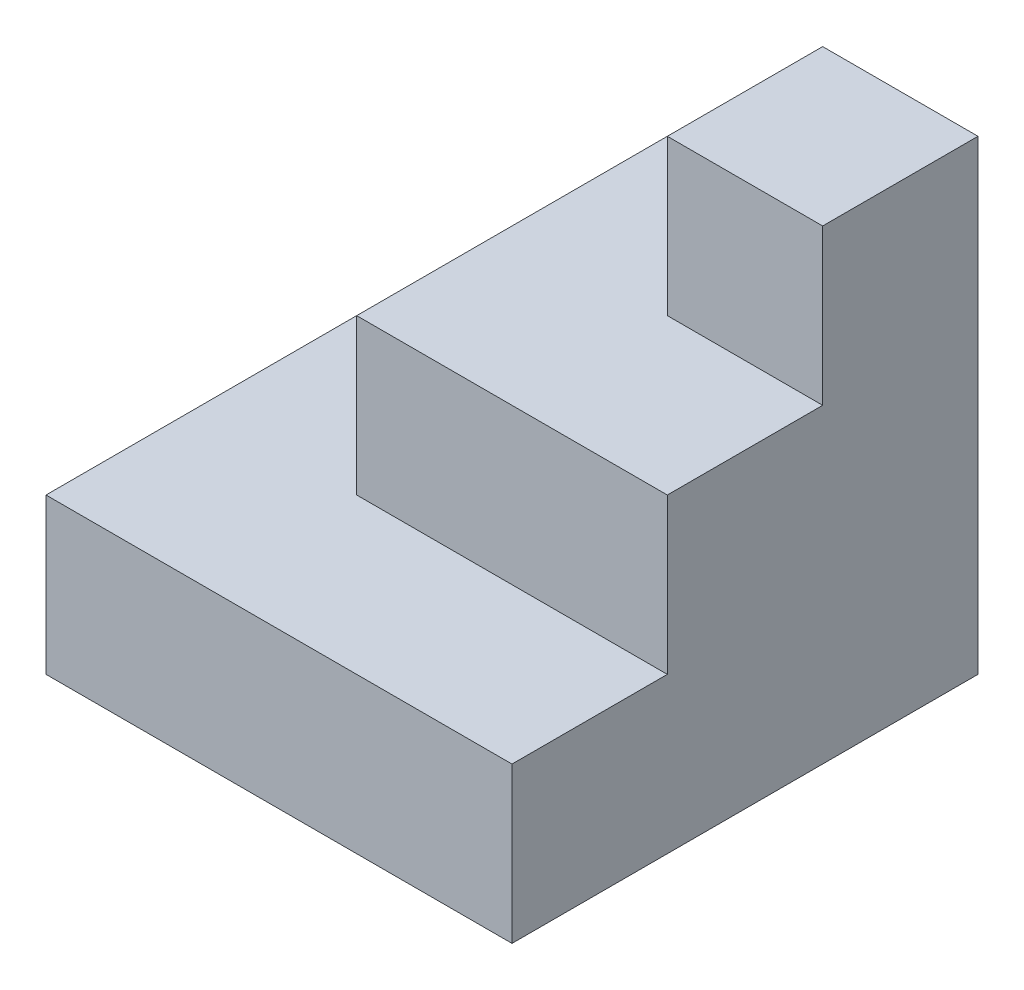
ISO-10303-21;
HEADER;
FILE_DESCRIPTION(('STEP AP214'),'2;1');
FILE_NAME('part.step','',(''),(''),'','','');
FILE_SCHEMA(('AUTOMOTIVE_DESIGN { 1 0 10303 214 1 1 1 1 }'));
ENDSEC;
DATA;
#1=APPLICATION_CONTEXT('core data for automotive mechanical design processes');
#2=APPLICATION_PROTOCOL_DEFINITION('international standard','automotive_design',2000,#1);
#3=PRODUCT_CONTEXT('',#1,'mechanical');
#4=PRODUCT('Part','Part','',(#3));
#5=PRODUCT_RELATED_PRODUCT_CATEGORY('part','',(#4));
#6=PRODUCT_DEFINITION_FORMATION('','',#4);
#7=PRODUCT_DEFINITION_CONTEXT('part definition',#1,'design');
#8=PRODUCT_DEFINITION('design','',#6,#7);
#9=PRODUCT_DEFINITION_SHAPE('','',#8);
#10=(LENGTH_UNIT() NAMED_UNIT(*) SI_UNIT(.MILLI.,.METRE.));
#11=(NAMED_UNIT(*) PLANE_ANGLE_UNIT() SI_UNIT($,.RADIAN.));
#12=(NAMED_UNIT(*) SI_UNIT($,.STERADIAN.) SOLID_ANGLE_UNIT());
#13=UNCERTAINTY_MEASURE_WITH_UNIT(LENGTH_MEASURE(1.E-05),#10,'distance_accuracy_value','');
#14=(GEOMETRIC_REPRESENTATION_CONTEXT(3) GLOBAL_UNCERTAINTY_ASSIGNED_CONTEXT((#13)) GLOBAL_UNIT_ASSIGNED_CONTEXT((#10,
#11,#12)) REPRESENTATION_CONTEXT('',''));
#15=CARTESIAN_POINT('',(0.,0.,0.));
#16=DIRECTION('',(0.,0.,1.));
#17=DIRECTION('',(1.,0.,0.));
#18=AXIS2_PLACEMENT_3D('',#15,#16,#17);
#19=CARTESIAN_POINT('',(0.,15.,15.));
#20=DIRECTION('',(0.,-1.,0.));
#21=DIRECTION('',(0.,0.,-1.));
#22=AXIS2_PLACEMENT_3D('',#19,#20,#21);
#23=PLANE('',#22);
#24=DIRECTION('',(-1.,0.,0.));
#25=VECTOR('',#24,1.);
#26=CARTESIAN_POINT('',(0.,15.,5.));
#27=LINE('',#26,#25);
#28=CARTESIAN_POINT('',(0.,15.,5.));
#29=VERTEX_POINT('',#28);
#30=CARTESIAN_POINT('',(-5.,15.,5.));
#31=VERTEX_POINT('',#30);
#32=EDGE_CURVE('E145',#29,#31,#27,.T.);
#33=ORIENTED_EDGE('',*,*,#32,.F.);
#34=DIRECTION('',(0.,0.,-1.));
#35=VECTOR('',#34,1.);
#36=CARTESIAN_POINT('',(0.,15.,15.));
#37=LINE('',#36,#35);
#38=CARTESIAN_POINT('',(0.,15.,0.));
#39=VERTEX_POINT('',#38);
#40=EDGE_CURVE('E49',#29,#39,#37,.T.);
#41=ORIENTED_EDGE('',*,*,#40,.T.);
#42=DIRECTION('',(-1.,0.,0.));
#43=VECTOR('',#42,1.);
#44=CARTESIAN_POINT('',(0.,15.,0.));
#45=LINE('',#44,#43);
#46=CARTESIAN_POINT('',(-5.,15.,0.));
#47=VERTEX_POINT('',#46);
#48=EDGE_CURVE('E170',#39,#47,#45,.T.);
#49=ORIENTED_EDGE('',*,*,#48,.T.);
#50=DIRECTION('',(0.,0.,-1.));
#51=VECTOR('',#50,1.);
#52=CARTESIAN_POINT('',(-5.,15.,15.));
#53=LINE('',#52,#51);
#54=EDGE_CURVE('E155',#31,#47,#53,.T.);
#55=ORIENTED_EDGE('',*,*,#54,.F.);
#56=EDGE_LOOP('',(#33,#41,#49,#55));
#57=FACE_BOUND('',#56,.T.);
#58=ADVANCED_FACE('F39',(#57),#23,.F.);
#59=CARTESIAN_POINT('',(-5.,15.,15.));
#60=DIRECTION('',(1.,0.,0.));
#61=DIRECTION('',(0.,1.,0.));
#62=AXIS2_PLACEMENT_3D('',#59,#60,#61);
#63=PLANE('',#62);
#64=DIRECTION('',(0.,-1.,0.));
#65=VECTOR('',#64,1.);
#66=CARTESIAN_POINT('',(-5.,15.,5.));
#67=LINE('',#66,#65);
#68=CARTESIAN_POINT('',(-5.,10.,5.));
#69=VERTEX_POINT('',#68);
#70=EDGE_CURVE('E140',#31,#69,#67,.T.);
#71=ORIENTED_EDGE('',*,*,#70,.F.);
#72=ORIENTED_EDGE('',*,*,#54,.T.);
#73=DIRECTION('',(0.,-1.,0.));
#74=VECTOR('',#73,1.);
#75=CARTESIAN_POINT('',(-5.,15.,0.));
#76=LINE('',#75,#74);
#77=CARTESIAN_POINT('',(-5.,10.,0.));
#78=VERTEX_POINT('',#77);
#79=EDGE_CURVE('E152',#47,#78,#76,.T.);
#80=ORIENTED_EDGE('',*,*,#79,.T.);
#81=DIRECTION('',(0.,0.,-1.));
#82=VECTOR('',#81,1.);
#83=CARTESIAN_POINT('',(-5.,10.,15.));
#84=LINE('',#83,#82);
#85=EDGE_CURVE('E132',#69,#78,#84,.T.);
#86=ORIENTED_EDGE('',*,*,#85,.F.);
#87=EDGE_LOOP('',(#71,#72,#80,#86));
#88=FACE_BOUND('',#87,.T.);
#89=ADVANCED_FACE('F150',(#88),#63,.F.);
#90=CARTESIAN_POINT('',(-5.,10.,15.));
#91=DIRECTION('',(0.,-1.,0.));
#92=DIRECTION('',(0.,0.,-1.));
#93=AXIS2_PLACEMENT_3D('',#90,#91,#92);
#94=PLANE('',#93);
#95=DIRECTION('',(0.,0.,-1.));
#96=VECTOR('',#95,1.);
#97=CARTESIAN_POINT('',(-10.,10.,15.));
#98=LINE('',#97,#96);
#99=CARTESIAN_POINT('',(-10.,10.,10.));
#100=VERTEX_POINT('',#99);
#101=CARTESIAN_POINT('',(-10.,10.,0.));
#102=VERTEX_POINT('',#101);
#103=EDGE_CURVE('E156',#100,#102,#98,.T.);
#104=ORIENTED_EDGE('',*,*,#103,.F.);
#105=DIRECTION('',(-1.,0.,0.));
#106=VECTOR('',#105,1.);
#107=CARTESIAN_POINT('',(-10.,10.,10.));
#108=LINE('',#107,#106);
#109=CARTESIAN_POINT('',(0.,10.,10.));
#110=VERTEX_POINT('',#109);
#111=EDGE_CURVE('E218',#110,#100,#108,.T.);
#112=ORIENTED_EDGE('',*,*,#111,.F.);
#113=DIRECTION('',(0.,0.,1.));
#114=VECTOR('',#113,1.);
#115=CARTESIAN_POINT('',(0.,10.,5.));
#116=LINE('',#115,#114);
#117=CARTESIAN_POINT('',(0.,10.,5.));
#118=VERTEX_POINT('',#117);
#119=EDGE_CURVE('E135',#118,#110,#116,.T.);
#120=ORIENTED_EDGE('',*,*,#119,.F.);
#121=DIRECTION('',(1.,0.,0.));
#122=VECTOR('',#121,1.);
#123=CARTESIAN_POINT('',(-5.,10.,5.));
#124=LINE('',#123,#122);
#125=EDGE_CURVE('E126',#69,#118,#124,.T.);
#126=ORIENTED_EDGE('',*,*,#125,.F.);
#127=ORIENTED_EDGE('',*,*,#85,.T.);
#128=DIRECTION('',(-1.,0.,0.));
#129=VECTOR('',#128,1.);
#130=CARTESIAN_POINT('',(-5.,10.,0.));
#131=LINE('',#130,#129);
#132=EDGE_CURVE('E184',#78,#102,#131,.T.);
#133=ORIENTED_EDGE('',*,*,#132,.T.);
#134=EDGE_LOOP('',(#104,#112,#120,#126,#127,#133));
#135=FACE_BOUND('',#134,.T.);
#136=ADVANCED_FACE('F129',(#135),#94,.F.);
#137=CARTESIAN_POINT('',(-10.,10.,15.));
#138=DIRECTION('',(1.,0.,0.));
#139=DIRECTION('',(0.,0.,-1.));
#140=AXIS2_PLACEMENT_3D('',#137,#138,#139);
#141=PLANE('',#140);
#142=DIRECTION('',(0.,-1.,0.));
#143=VECTOR('',#142,1.);
#144=CARTESIAN_POINT('',(-10.,10.,10.));
#145=LINE('',#144,#143);
#146=CARTESIAN_POINT('',(-10.,5.,10.));
#147=VERTEX_POINT('',#146);
#148=EDGE_CURVE('E238',#100,#147,#145,.T.);
#149=ORIENTED_EDGE('',*,*,#148,.F.);
#150=ORIENTED_EDGE('',*,*,#103,.T.);
#151=DIRECTION('',(0.,-1.,0.));
#152=VECTOR('',#151,1.);
#153=CARTESIAN_POINT('',(-10.,10.,0.));
#154=LINE('',#153,#152);
#155=CARTESIAN_POINT('',(-10.,5.,0.));
#156=VERTEX_POINT('',#155);
#157=EDGE_CURVE('E190',#102,#156,#154,.T.);
#158=ORIENTED_EDGE('',*,*,#157,.T.);
#159=DIRECTION('',(0.,0.,-1.));
#160=VECTOR('',#159,1.);
#161=CARTESIAN_POINT('',(-10.,5.,15.));
#162=LINE('',#161,#160);
#163=EDGE_CURVE('E161',#147,#156,#162,.T.);
#164=ORIENTED_EDGE('',*,*,#163,.F.);
#165=EDGE_LOOP('',(#149,#150,#158,#164));
#166=FACE_BOUND('',#165,.T.);
#167=ADVANCED_FACE('F213',(#166),#141,.F.);
#168=CARTESIAN_POINT('',(-15.,0.,15.));
#169=DIRECTION('',(0.,1.,0.));
#170=DIRECTION('',(0.,0.,1.));
#171=AXIS2_PLACEMENT_3D('',#168,#169,#170);
#172=PLANE('',#171);
#173=DIRECTION('',(1.,0.,0.));
#174=VECTOR('',#173,1.);
#175=CARTESIAN_POINT('',(-15.,0.,0.));
#176=LINE('',#175,#174);
#177=CARTESIAN_POINT('',(-15.,0.,0.));
#178=VERTEX_POINT('',#177);
#179=CARTESIAN_POINT('',(0.,0.,0.));
#180=VERTEX_POINT('',#179);
#181=EDGE_CURVE('E178',#178,#180,#176,.T.);
#182=ORIENTED_EDGE('',*,*,#181,.T.);
#183=DIRECTION('',(0.,0.,-1.));
#184=VECTOR('',#183,1.);
#185=CARTESIAN_POINT('',(0.,0.,15.));
#186=LINE('',#185,#184);
#187=CARTESIAN_POINT('',(0.,0.,15.));
#188=VERTEX_POINT('',#187);
#189=EDGE_CURVE('E11',#188,#180,#186,.T.);
#190=ORIENTED_EDGE('',*,*,#189,.F.);
#191=DIRECTION('',(1.,0.,0.));
#192=VECTOR('',#191,1.);
#193=CARTESIAN_POINT('',(-15.,0.,15.));
#194=LINE('',#193,#192);
#195=CARTESIAN_POINT('',(-15.,0.,15.));
#196=VERTEX_POINT('',#195);
#197=EDGE_CURVE('E198',#196,#188,#194,.T.);
#198=ORIENTED_EDGE('',*,*,#197,.F.);
#199=DIRECTION('',(0.,0.,-1.));
#200=VECTOR('',#199,1.);
#201=CARTESIAN_POINT('',(-15.,0.,15.));
#202=LINE('',#201,#200);
#203=EDGE_CURVE('E199',#196,#178,#202,.T.);
#204=ORIENTED_EDGE('',*,*,#203,.T.);
#205=EDGE_LOOP('',(#182,#190,#198,#204));
#206=FACE_BOUND('',#205,.T.);
#207=ADVANCED_FACE('F41',(#206),#172,.F.);
#208=CARTESIAN_POINT('',(0.,0.,15.));
#209=DIRECTION('',(-1.,0.,0.));
#210=DIRECTION('',(0.,0.,1.));
#211=AXIS2_PLACEMENT_3D('',#208,#209,#210);
#212=PLANE('',#211);
#213=DIRECTION('',(0.,1.,0.));
#214=VECTOR('',#213,1.);
#215=CARTESIAN_POINT('',(0.,10.,5.));
#216=LINE('',#215,#214);
#217=EDGE_CURVE('E139',#118,#29,#216,.T.);
#218=ORIENTED_EDGE('',*,*,#217,.F.);
#219=ORIENTED_EDGE('',*,*,#119,.T.);
#220=DIRECTION('',(0.,1.,0.));
#221=VECTOR('',#220,1.);
#222=CARTESIAN_POINT('',(0.,10.,10.));
#223=LINE('',#222,#221);
#224=CARTESIAN_POINT('',(0.,5.,10.));
#225=VERTEX_POINT('',#224);
#226=EDGE_CURVE('E232',#225,#110,#223,.T.);
#227=ORIENTED_EDGE('',*,*,#226,.F.);
#228=DIRECTION('',(0.,0.,1.));
#229=VECTOR('',#228,1.);
#230=CARTESIAN_POINT('',(0.,5.,10.));
#231=LINE('',#230,#229);
#232=CARTESIAN_POINT('',(0.,5.,15.));
#233=VERTEX_POINT('',#232);
#234=EDGE_CURVE('E216',#225,#233,#231,.T.);
#235=ORIENTED_EDGE('',*,*,#234,.T.);
#236=DIRECTION('',(0.,1.,0.));
#237=VECTOR('',#236,1.);
#238=CARTESIAN_POINT('',(0.,0.,15.));
#239=LINE('',#238,#237);
#240=EDGE_CURVE('E97',#188,#233,#239,.T.);
#241=ORIENTED_EDGE('',*,*,#240,.F.);
#242=ORIENTED_EDGE('',*,*,#189,.T.);
#243=DIRECTION('',(0.,1.,0.));
#244=VECTOR('',#243,1.);
#245=CARTESIAN_POINT('',(0.,0.,0.));
#246=LINE('',#245,#244);
#247=EDGE_CURVE('E171',#180,#39,#246,.T.);
#248=ORIENTED_EDGE('',*,*,#247,.T.);
#249=ORIENTED_EDGE('',*,*,#40,.F.);
#250=EDGE_LOOP('',(#218,#219,#227,#235,#241,#242,#248,#249));
#251=FACE_BOUND('',#250,.T.);
#252=ADVANCED_FACE('F172',(#251),#212,.F.);
#253=CARTESIAN_POINT('',(-10.,5.,15.));
#254=DIRECTION('',(0.,-1.,0.));
#255=DIRECTION('',(1.,0.,0.));
#256=AXIS2_PLACEMENT_3D('',#253,#254,#255);
#257=PLANE('',#256);
#258=DIRECTION('',(-1.,0.,0.));
#259=VECTOR('',#258,1.);
#260=CARTESIAN_POINT('',(-10.,5.,0.));
#261=LINE('',#260,#259);
#262=CARTESIAN_POINT('',(-15.,5.,0.));
#263=VERTEX_POINT('',#262);
#264=EDGE_CURVE('E86',#156,#263,#261,.T.);
#265=ORIENTED_EDGE('',*,*,#264,.T.);
#266=DIRECTION('',(0.,0.,-1.));
#267=VECTOR('',#266,1.);
#268=CARTESIAN_POINT('',(-15.,5.,15.));
#269=LINE('',#268,#267);
#270=CARTESIAN_POINT('',(-15.,5.,15.));
#271=VERTEX_POINT('',#270);
#272=EDGE_CURVE('E202',#271,#263,#269,.T.);
#273=ORIENTED_EDGE('',*,*,#272,.F.);
#274=DIRECTION('',(-1.,0.,0.));
#275=VECTOR('',#274,1.);
#276=CARTESIAN_POINT('',(-10.,5.,15.));
#277=LINE('',#276,#275);
#278=EDGE_CURVE('E223',#233,#271,#277,.T.);
#279=ORIENTED_EDGE('',*,*,#278,.F.);
#280=ORIENTED_EDGE('',*,*,#234,.F.);
#281=DIRECTION('',(1.,0.,0.));
#282=VECTOR('',#281,1.);
#283=CARTESIAN_POINT('',(-10.,5.,10.));
#284=LINE('',#283,#282);
#285=EDGE_CURVE('E208',#147,#225,#284,.T.);
#286=ORIENTED_EDGE('',*,*,#285,.F.);
#287=ORIENTED_EDGE('',*,*,#163,.T.);
#288=EDGE_LOOP('',(#265,#273,#279,#280,#286,#287));
#289=FACE_BOUND('',#288,.T.);
#290=ADVANCED_FACE('F206',(#289),#257,.F.);
#291=CARTESIAN_POINT('',(-15.,5.,15.));
#292=DIRECTION('',(1.,0.,0.));
#293=DIRECTION('',(0.,0.,-1.));
#294=AXIS2_PLACEMENT_3D('',#291,#292,#293);
#295=PLANE('',#294);
#296=DIRECTION('',(0.,-1.,0.));
#297=VECTOR('',#296,1.);
#298=CARTESIAN_POINT('',(-15.,5.,0.));
#299=LINE('',#298,#297);
#300=EDGE_CURVE('E91',#263,#178,#299,.T.);
#301=ORIENTED_EDGE('',*,*,#300,.T.);
#302=ORIENTED_EDGE('',*,*,#203,.F.);
#303=DIRECTION('',(0.,-1.,0.));
#304=VECTOR('',#303,1.);
#305=CARTESIAN_POINT('',(-15.,5.,15.));
#306=LINE('',#305,#304);
#307=EDGE_CURVE('E57',#271,#196,#306,.T.);
#308=ORIENTED_EDGE('',*,*,#307,.F.);
#309=ORIENTED_EDGE('',*,*,#272,.T.);
#310=EDGE_LOOP('',(#301,#302,#308,#309));
#311=FACE_BOUND('',#310,.T.);
#312=ADVANCED_FACE('F271',(#311),#295,.F.);
#313=CARTESIAN_POINT('',(0.,0.,15.));
#314=DIRECTION('',(0.,0.,1.));
#315=DIRECTION('',(1.,0.,0.));
#316=AXIS2_PLACEMENT_3D('',#313,#314,#315);
#317=PLANE('',#316);
#318=ORIENTED_EDGE('',*,*,#240,.T.);
#319=ORIENTED_EDGE('',*,*,#278,.T.);
#320=ORIENTED_EDGE('',*,*,#307,.T.);
#321=ORIENTED_EDGE('',*,*,#197,.T.);
#322=EDGE_LOOP('',(#318,#319,#320,#321));
#323=FACE_BOUND('',#322,.T.);
#324=ADVANCED_FACE('F256',(#323),#317,.T.);
#325=CARTESIAN_POINT('',(0.,0.,0.));
#326=DIRECTION('',(0.,0.,1.));
#327=DIRECTION('',(1.,0.,0.));
#328=AXIS2_PLACEMENT_3D('',#325,#326,#327);
#329=PLANE('',#328);
#330=ORIENTED_EDGE('',*,*,#181,.F.);
#331=ORIENTED_EDGE('',*,*,#300,.F.);
#332=ORIENTED_EDGE('',*,*,#264,.F.);
#333=ORIENTED_EDGE('',*,*,#157,.F.);
#334=ORIENTED_EDGE('',*,*,#132,.F.);
#335=ORIENTED_EDGE('',*,*,#79,.F.);
#336=ORIENTED_EDGE('',*,*,#48,.F.);
#337=ORIENTED_EDGE('',*,*,#247,.F.);
#338=EDGE_LOOP('',(#330,#331,#332,#333,#334,#335,#336,#337));
#339=FACE_BOUND('',#338,.T.);
#340=ADVANCED_FACE('F180',(#339),#329,.F.);
#341=CARTESIAN_POINT('',(0.,0.,10.));
#342=DIRECTION('',(0.,0.,1.));
#343=DIRECTION('',(1.,0.,0.));
#344=AXIS2_PLACEMENT_3D('',#341,#342,#343);
#345=PLANE('',#344);
#346=ORIENTED_EDGE('',*,*,#148,.T.);
#347=ORIENTED_EDGE('',*,*,#285,.T.);
#348=ORIENTED_EDGE('',*,*,#226,.T.);
#349=ORIENTED_EDGE('',*,*,#111,.T.);
#350=EDGE_LOOP('',(#346,#347,#348,#349));
#351=FACE_BOUND('',#350,.T.);
#352=ADVANCED_FACE('F248',(#351),#345,.T.);
#353=CARTESIAN_POINT('',(0.,0.,5.));
#354=DIRECTION('',(0.,0.,1.));
#355=DIRECTION('',(1.,0.,0.));
#356=AXIS2_PLACEMENT_3D('',#353,#354,#355);
#357=PLANE('',#356);
#358=ORIENTED_EDGE('',*,*,#70,.T.);
#359=ORIENTED_EDGE('',*,*,#125,.T.);
#360=ORIENTED_EDGE('',*,*,#217,.T.);
#361=ORIENTED_EDGE('',*,*,#32,.T.);
#362=EDGE_LOOP('',(#358,#359,#360,#361));
#363=FACE_BOUND('',#362,.T.);
#364=ADVANCED_FACE('F143',(#363),#357,.T.);
#365=CLOSED_SHELL('',(#58,#89,#136,#167,#207,#252,#290,#312,#324,#340,#352,#364));
#366=MANIFOLD_SOLID_BREP('B2',#365);
#367=ADVANCED_BREP_SHAPE_REPRESENTATION('',(#18,#366),#14);
#368=SHAPE_DEFINITION_REPRESENTATION(#9,#367);
ENDSEC;
END-ISO-10303-21;
